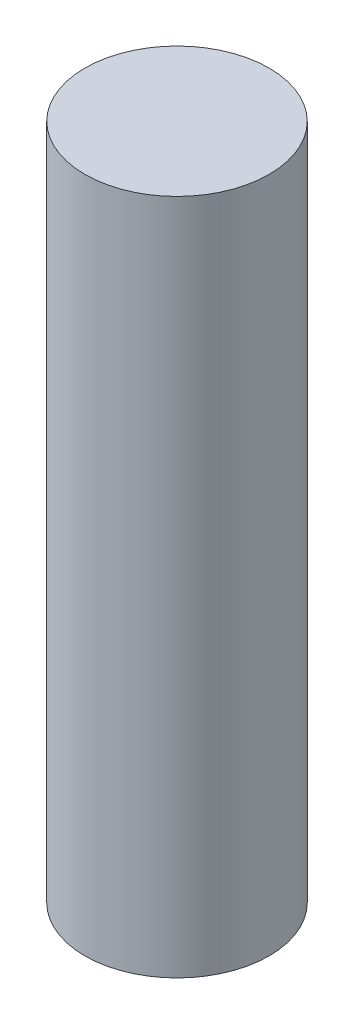
ISO-10303-21;
HEADER;
FILE_DESCRIPTION(('STEP AP214'),'2;1');
FILE_NAME('part.step','',(''),(''),'','','');
FILE_SCHEMA(('AUTOMOTIVE_DESIGN { 1 0 10303 214 1 1 1 1 }'));
ENDSEC;
DATA;
#1=APPLICATION_CONTEXT('core data for automotive mechanical design processes');
#2=APPLICATION_PROTOCOL_DEFINITION('international standard','automotive_design',2000,#1);
#3=PRODUCT_CONTEXT('',#1,'mechanical');
#4=PRODUCT('Part','Part','',(#3));
#5=PRODUCT_RELATED_PRODUCT_CATEGORY('part','',(#4));
#6=PRODUCT_DEFINITION_FORMATION('','',#4);
#7=PRODUCT_DEFINITION_CONTEXT('part definition',#1,'design');
#8=PRODUCT_DEFINITION('design','',#6,#7);
#9=PRODUCT_DEFINITION_SHAPE('','',#8);
#10=(LENGTH_UNIT() NAMED_UNIT(*) SI_UNIT(.MILLI.,.METRE.));
#11=(NAMED_UNIT(*) PLANE_ANGLE_UNIT() SI_UNIT($,.RADIAN.));
#12=(NAMED_UNIT(*) SI_UNIT($,.STERADIAN.) SOLID_ANGLE_UNIT());
#13=UNCERTAINTY_MEASURE_WITH_UNIT(LENGTH_MEASURE(1.E-05),#10,'distance_accuracy_value','');
#14=(GEOMETRIC_REPRESENTATION_CONTEXT(3) GLOBAL_UNCERTAINTY_ASSIGNED_CONTEXT((#13)) GLOBAL_UNIT_ASSIGNED_CONTEXT((#10,
#11,#12)) REPRESENTATION_CONTEXT('',''));
#15=CARTESIAN_POINT('',(0.,0.,0.));
#16=DIRECTION('',(0.,0.,1.));
#17=DIRECTION('',(1.,0.,0.));
#18=AXIS2_PLACEMENT_3D('',#15,#16,#17);
#19=CARTESIAN_POINT('',(0.,18.,0.));
#20=DIRECTION('',(0.,-1.,0.));
#21=DIRECTION('',(0.,0.,-1.));
#22=AXIS2_PLACEMENT_3D('',#19,#20,#21);
#23=CYLINDRICAL_SURFACE('',#22,2.45);
#24=CARTESIAN_POINT('',(0.,18.,0.));
#25=DIRECTION('',(0.,1.,0.));
#26=DIRECTION('',(0.,0.,1.));
#27=AXIS2_PLACEMENT_3D('',#24,#25,#26);
#28=CIRCLE('',#27,2.45);
#29=CARTESIAN_POINT('',(0.,18.,2.45));
#30=VERTEX_POINT('',#29);
#31=EDGE_CURVE('E10',#30,#30,#28,.T.);
#32=ORIENTED_EDGE('',*,*,#31,.F.);
#33=EDGE_LOOP('',(#32));
#34=FACE_BOUND('',#33,.T.);
#35=CARTESIAN_POINT('',(0.,0.,0.));
#36=DIRECTION('',(0.,1.,0.));
#37=DIRECTION('',(0.,0.,1.));
#38=AXIS2_PLACEMENT_3D('',#35,#36,#37);
#39=CIRCLE('',#38,2.45);
#40=CARTESIAN_POINT('',(0.,0.,2.45));
#41=VERTEX_POINT('',#40);
#42=EDGE_CURVE('E46',#41,#41,#39,.T.);
#43=ORIENTED_EDGE('',*,*,#42,.T.);
#44=EDGE_LOOP('',(#43));
#45=FACE_BOUND('',#44,.T.);
#46=ADVANCED_FACE('F43',(#34,#45),#23,.T.);
#47=CARTESIAN_POINT('',(0.,18.,0.));
#48=DIRECTION('',(0.,1.,0.));
#49=DIRECTION('',(0.,0.,1.));
#50=AXIS2_PLACEMENT_3D('',#47,#48,#49);
#51=PLANE('',#50);
#52=ORIENTED_EDGE('',*,*,#31,.T.);
#53=EDGE_LOOP('',(#52));
#54=FACE_BOUND('',#53,.T.);
#55=ADVANCED_FACE('F60',(#54),#51,.T.);
#56=CARTESIAN_POINT('',(0.,0.,0.));
#57=DIRECTION('',(0.,1.,0.));
#58=DIRECTION('',(0.,0.,1.));
#59=AXIS2_PLACEMENT_3D('',#56,#57,#58);
#60=PLANE('',#59);
#61=ORIENTED_EDGE('',*,*,#42,.F.);
#62=EDGE_LOOP('',(#61));
#63=FACE_BOUND('',#62,.T.);
#64=ADVANCED_FACE('F58',(#63),#60,.F.);
#65=CLOSED_SHELL('',(#46,#55,#64));
#66=MANIFOLD_SOLID_BREP('B2',#65);
#67=ADVANCED_BREP_SHAPE_REPRESENTATION('',(#18,#66),#14);
#68=SHAPE_DEFINITION_REPRESENTATION(#9,#67);
ENDSEC;
END-ISO-10303-21;
